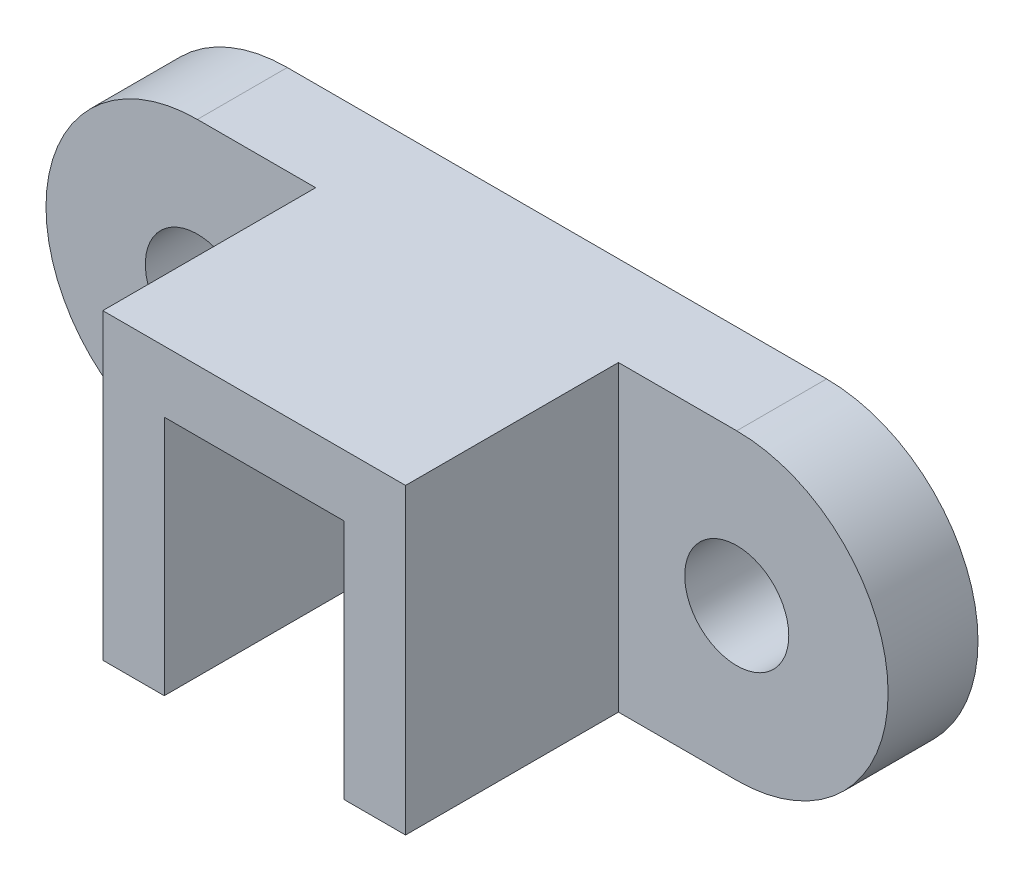
ISO-10303-21;
HEADER;
FILE_DESCRIPTION(('STEP AP214'),'2;1');
FILE_NAME('part.step','',(''),(''),'','','');
FILE_SCHEMA(('AUTOMOTIVE_DESIGN { 1 0 10303 214 1 1 1 1 }'));
ENDSEC;
DATA;
#1=APPLICATION_CONTEXT('core data for automotive mechanical design processes');
#2=APPLICATION_PROTOCOL_DEFINITION('international standard','automotive_design',2000,#1);
#3=PRODUCT_CONTEXT('',#1,'mechanical');
#4=PRODUCT('Part','Part','',(#3));
#5=PRODUCT_RELATED_PRODUCT_CATEGORY('part','',(#4));
#6=PRODUCT_DEFINITION_FORMATION('','',#4);
#7=PRODUCT_DEFINITION_CONTEXT('part definition',#1,'design');
#8=PRODUCT_DEFINITION('design','',#6,#7);
#9=PRODUCT_DEFINITION_SHAPE('','',#8);
#10=(LENGTH_UNIT() NAMED_UNIT(*) SI_UNIT(.MILLI.,.METRE.));
#11=(NAMED_UNIT(*) PLANE_ANGLE_UNIT() SI_UNIT($,.RADIAN.));
#12=(NAMED_UNIT(*) SI_UNIT($,.STERADIAN.) SOLID_ANGLE_UNIT());
#13=UNCERTAINTY_MEASURE_WITH_UNIT(LENGTH_MEASURE(1.E-05),#10,'distance_accuracy_value','');
#14=(GEOMETRIC_REPRESENTATION_CONTEXT(3) GLOBAL_UNCERTAINTY_ASSIGNED_CONTEXT((#13)) GLOBAL_UNIT_ASSIGNED_CONTEXT((#10,
#11,#12)) REPRESENTATION_CONTEXT('',''));
#15=CARTESIAN_POINT('',(0.,0.,0.));
#16=DIRECTION('',(0.,0.,1.));
#17=DIRECTION('',(1.,0.,0.));
#18=AXIS2_PLACEMENT_3D('',#15,#16,#17);
#19=CARTESIAN_POINT('',(0.,-32.,19.));
#20=DIRECTION('',(0.,1.,0.));
#21=DIRECTION('',(-1.,0.,0.));
#22=AXIS2_PLACEMENT_3D('',#19,#20,#21);
#23=PLANE('',#22);
#24=DIRECTION('',(0.,0.,1.));
#25=VECTOR('',#24,1.);
#26=CARTESIAN_POINT('',(-38.,-32.,13.));
#27=LINE('',#26,#25);
#28=CARTESIAN_POINT('',(-38.,-32.,13.));
#29=VERTEX_POINT('',#28);
#30=CARTESIAN_POINT('',(-38.,-32.,64.));
#31=VERTEX_POINT('',#30);
#32=EDGE_CURVE('E120',#29,#31,#27,.T.);
#33=ORIENTED_EDGE('',*,*,#32,.F.);
#34=DIRECTION('',(-1.,0.,0.));
#35=VECTOR('',#34,1.);
#36=CARTESIAN_POINT('',(-38.,-32.,13.));
#37=LINE('',#36,#35);
#38=CARTESIAN_POINT('',(-76.,-32.,13.));
#39=VERTEX_POINT('',#38);
#40=EDGE_CURVE('E152',#29,#39,#37,.T.);
#41=ORIENTED_EDGE('',*,*,#40,.T.);
#42=DIRECTION('',(0.,0.,1.));
#43=VECTOR('',#42,1.);
#44=CARTESIAN_POINT('',(-76.,-32.,13.));
#45=LINE('',#44,#43);
#46=CARTESIAN_POINT('',(-76.,-32.,64.));
#47=VERTEX_POINT('',#46);
#48=EDGE_CURVE('E234',#39,#47,#45,.T.);
#49=ORIENTED_EDGE('',*,*,#48,.T.);
#50=DIRECTION('',(1.,0.,0.));
#51=VECTOR('',#50,1.);
#52=CARTESIAN_POINT('',(-89.,-32.,64.));
#53=LINE('',#52,#51);
#54=CARTESIAN_POINT('',(-89.,-32.,64.));
#55=VERTEX_POINT('',#54);
#56=EDGE_CURVE('E142',#55,#47,#53,.T.);
#57=ORIENTED_EDGE('',*,*,#56,.F.);
#58=DIRECTION('',(0.,0.,-1.));
#59=VECTOR('',#58,1.);
#60=CARTESIAN_POINT('',(-89.,-32.,64.));
#61=LINE('',#60,#59);
#62=CARTESIAN_POINT('',(-89.,-32.,19.));
#63=VERTEX_POINT('',#62);
#64=EDGE_CURVE('E157',#55,#63,#61,.T.);
#65=ORIENTED_EDGE('',*,*,#64,.T.);
#66=DIRECTION('',(1.,0.,0.));
#67=VECTOR('',#66,1.);
#68=CARTESIAN_POINT('',(0.,-32.,19.));
#69=LINE('',#68,#67);
#70=CARTESIAN_POINT('',(-114.,-32.,19.));
#71=VERTEX_POINT('',#70);
#72=EDGE_CURVE('E189',#71,#63,#69,.T.);
#73=ORIENTED_EDGE('',*,*,#72,.F.);
#74=DIRECTION('',(0.,0.,-1.));
#75=VECTOR('',#74,1.);
#76=CARTESIAN_POINT('',(-114.,-32.,19.));
#77=LINE('',#76,#75);
#78=CARTESIAN_POINT('',(-114.,-32.,0.));
#79=VERTEX_POINT('',#78);
#80=EDGE_CURVE('E201',#71,#79,#77,.T.);
#81=ORIENTED_EDGE('',*,*,#80,.T.);
#82=DIRECTION('',(1.,0.,0.));
#83=VECTOR('',#82,1.);
#84=CARTESIAN_POINT('',(0.,-32.,0.));
#85=LINE('',#84,#83);
#86=CARTESIAN_POINT('',(0.,-32.,0.));
#87=VERTEX_POINT('',#86);
#88=EDGE_CURVE('E183',#79,#87,#85,.T.);
#89=ORIENTED_EDGE('',*,*,#88,.T.);
#90=DIRECTION('',(0.,0.,-1.));
#91=VECTOR('',#90,1.);
#92=CARTESIAN_POINT('',(0.,-32.,19.));
#93=LINE('',#92,#91);
#94=CARTESIAN_POINT('',(0.,-32.,19.));
#95=VERTEX_POINT('',#94);
#96=EDGE_CURVE('E191',#95,#87,#93,.T.);
#97=ORIENTED_EDGE('',*,*,#96,.F.);
#98=CARTESIAN_POINT('',(-25.,-32.,19.));
#99=VERTEX_POINT('',#98);
#100=EDGE_CURVE('E188',#99,#95,#69,.T.);
#101=ORIENTED_EDGE('',*,*,#100,.F.);
#102=DIRECTION('',(0.,0.,-1.));
#103=VECTOR('',#102,1.);
#104=CARTESIAN_POINT('',(-25.,-32.,64.));
#105=LINE('',#104,#103);
#106=CARTESIAN_POINT('',(-25.,-32.,64.));
#107=VERTEX_POINT('',#106);
#108=EDGE_CURVE('E140',#107,#99,#105,.T.);
#109=ORIENTED_EDGE('',*,*,#108,.F.);
#110=EDGE_CURVE('E134',#31,#107,#53,.T.);
#111=ORIENTED_EDGE('',*,*,#110,.F.);
#112=EDGE_LOOP('',(#33,#41,#49,#57,#65,#73,#81,#89,#97,#101,#109,#111));
#113=FACE_BOUND('',#112,.T.);
#114=ADVANCED_FACE('F37',(#113),#23,.F.);
#115=CARTESIAN_POINT('',(0.,0.,64.));
#116=DIRECTION('',(0.,0.,1.));
#117=DIRECTION('',(1.,0.,0.));
#118=AXIS2_PLACEMENT_3D('',#115,#116,#117);
#119=PLANE('',#118);
#120=DIRECTION('',(-1.,0.,0.));
#121=VECTOR('',#120,1.);
#122=CARTESIAN_POINT('',(-38.,19.,64.));
#123=LINE('',#122,#121);
#124=CARTESIAN_POINT('',(-38.,19.,64.));
#125=VERTEX_POINT('',#124);
#126=CARTESIAN_POINT('',(-76.,19.,64.));
#127=VERTEX_POINT('',#126);
#128=EDGE_CURVE('E137',#125,#127,#123,.T.);
#129=ORIENTED_EDGE('',*,*,#128,.F.);
#130=DIRECTION('',(0.,1.,0.));
#131=VECTOR('',#130,1.);
#132=CARTESIAN_POINT('',(-38.,-32.,64.));
#133=LINE('',#132,#131);
#134=EDGE_CURVE('E123',#31,#125,#133,.T.);
#135=ORIENTED_EDGE('',*,*,#134,.F.);
#136=ORIENTED_EDGE('',*,*,#110,.T.);
#137=DIRECTION('',(0.,1.,0.));
#138=VECTOR('',#137,1.);
#139=CARTESIAN_POINT('',(-25.,32.,64.));
#140=LINE('',#139,#138);
#141=CARTESIAN_POINT('',(-25.,32.,64.));
#142=VERTEX_POINT('',#141);
#143=EDGE_CURVE('E155',#107,#142,#140,.T.);
#144=ORIENTED_EDGE('',*,*,#143,.T.);
#145=DIRECTION('',(-1.,0.,0.));
#146=VECTOR('',#145,1.);
#147=CARTESIAN_POINT('',(-89.,32.,64.));
#148=LINE('',#147,#146);
#149=CARTESIAN_POINT('',(-89.,32.,64.));
#150=VERTEX_POINT('',#149);
#151=EDGE_CURVE('E146',#142,#150,#148,.T.);
#152=ORIENTED_EDGE('',*,*,#151,.T.);
#153=DIRECTION('',(0.,-1.,0.));
#154=VECTOR('',#153,1.);
#155=CARTESIAN_POINT('',(-89.,32.,64.));
#156=LINE('',#155,#154);
#157=EDGE_CURVE('E143',#150,#55,#156,.T.);
#158=ORIENTED_EDGE('',*,*,#157,.T.);
#159=ORIENTED_EDGE('',*,*,#56,.T.);
#160=DIRECTION('',(0.,1.,0.));
#161=VECTOR('',#160,1.);
#162=CARTESIAN_POINT('',(-76.,-32.,64.));
#163=LINE('',#162,#161);
#164=EDGE_CURVE('E232',#47,#127,#163,.T.);
#165=ORIENTED_EDGE('',*,*,#164,.T.);
#166=EDGE_LOOP('',(#129,#135,#136,#144,#152,#158,#159,#165));
#167=FACE_BOUND('',#166,.T.);
#168=ADVANCED_FACE('F132',(#167),#119,.T.);
#169=CARTESIAN_POINT('',(0.,0.,19.));
#170=DIRECTION('',(0.,0.,1.));
#171=DIRECTION('',(1.,0.,0.));
#172=AXIS2_PLACEMENT_3D('',#169,#170,#171);
#173=PLANE('',#172);
#174=DIRECTION('',(0.,1.,0.));
#175=VECTOR('',#174,1.);
#176=CARTESIAN_POINT('',(-25.,32.,19.));
#177=LINE('',#176,#175);
#178=CARTESIAN_POINT('',(-25.,32.,19.));
#179=VERTEX_POINT('',#178);
#180=EDGE_CURVE('E60',#99,#179,#177,.T.);
#181=ORIENTED_EDGE('',*,*,#180,.F.);
#182=ORIENTED_EDGE('',*,*,#100,.T.);
#183=CARTESIAN_POINT('',(0.,0.,19.));
#184=DIRECTION('',(0.,0.,1.));
#185=DIRECTION('',(1.,0.,0.));
#186=AXIS2_PLACEMENT_3D('',#183,#184,#185);
#187=CIRCLE('',#186,32.);
#188=CARTESIAN_POINT('',(0.,32.,19.));
#189=VERTEX_POINT('',#188);
#190=EDGE_CURVE('E179',#95,#189,#187,.T.);
#191=ORIENTED_EDGE('',*,*,#190,.T.);
#192=DIRECTION('',(-1.,0.,0.));
#193=VECTOR('',#192,1.);
#194=CARTESIAN_POINT('',(0.,32.,19.));
#195=LINE('',#194,#193);
#196=EDGE_CURVE('E184',#189,#179,#195,.T.);
#197=ORIENTED_EDGE('',*,*,#196,.T.);
#198=EDGE_LOOP('',(#181,#182,#191,#197));
#199=FACE_BOUND('',#198,.T.);
#200=CARTESIAN_POINT('',(0.,0.,19.));
#201=DIRECTION('',(0.,0.,1.));
#202=DIRECTION('',(1.,0.,0.));
#203=AXIS2_PLACEMENT_3D('',#200,#201,#202);
#204=CIRCLE('',#203,11.);
#205=CARTESIAN_POINT('',(11.,0.,19.));
#206=VERTEX_POINT('',#205);
#207=EDGE_CURVE('E167',#206,#206,#204,.T.);
#208=ORIENTED_EDGE('',*,*,#207,.F.);
#209=EDGE_LOOP('',(#208));
#210=FACE_BOUND('',#209,.T.);
#211=ADVANCED_FACE('F222',(#199,#210),#173,.T.);
#212=DIRECTION('',(0.,-1.,0.));
#213=VECTOR('',#212,1.);
#214=CARTESIAN_POINT('',(-89.,32.,19.));
#215=LINE('',#214,#213);
#216=CARTESIAN_POINT('',(-89.,32.,19.));
#217=VERTEX_POINT('',#216);
#218=EDGE_CURVE('E151',#217,#63,#215,.T.);
#219=ORIENTED_EDGE('',*,*,#218,.F.);
#220=CARTESIAN_POINT('',(-114.,32.,19.));
#221=VERTEX_POINT('',#220);
#222=EDGE_CURVE('E182',#217,#221,#195,.T.);
#223=ORIENTED_EDGE('',*,*,#222,.T.);
#224=CARTESIAN_POINT('',(-114.,0.,19.));
#225=DIRECTION('',(0.,0.,1.));
#226=DIRECTION('',(1.,0.,0.));
#227=AXIS2_PLACEMENT_3D('',#224,#225,#226);
#228=CIRCLE('',#227,32.);
#229=EDGE_CURVE('E186',#221,#71,#228,.T.);
#230=ORIENTED_EDGE('',*,*,#229,.T.);
#231=ORIENTED_EDGE('',*,*,#72,.T.);
#232=EDGE_LOOP('',(#219,#223,#230,#231));
#233=FACE_BOUND('',#232,.T.);
#234=CARTESIAN_POINT('',(-114.,0.,19.));
#235=DIRECTION('',(0.,0.,1.));
#236=DIRECTION('',(1.,0.,0.));
#237=AXIS2_PLACEMENT_3D('',#234,#235,#236);
#238=CIRCLE('',#237,11.);
#239=CARTESIAN_POINT('',(-103.,0.,19.));
#240=VERTEX_POINT('',#239);
#241=EDGE_CURVE('E173',#240,#240,#238,.T.);
#242=ORIENTED_EDGE('',*,*,#241,.F.);
#243=EDGE_LOOP('',(#242));
#244=FACE_BOUND('',#243,.T.);
#245=ADVANCED_FACE('F244',(#233,#244),#173,.T.);
#246=CARTESIAN_POINT('',(0.,0.,0.));
#247=DIRECTION('',(0.,0.,1.));
#248=DIRECTION('',(1.,0.,0.));
#249=AXIS2_PLACEMENT_3D('',#246,#247,#248);
#250=PLANE('',#249);
#251=CARTESIAN_POINT('',(0.,0.,0.));
#252=DIRECTION('',(0.,0.,1.));
#253=DIRECTION('',(1.,0.,0.));
#254=AXIS2_PLACEMENT_3D('',#251,#252,#253);
#255=CIRCLE('',#254,32.);
#256=CARTESIAN_POINT('',(0.,32.,0.));
#257=VERTEX_POINT('',#256);
#258=EDGE_CURVE('E176',#87,#257,#255,.T.);
#259=ORIENTED_EDGE('',*,*,#258,.F.);
#260=ORIENTED_EDGE('',*,*,#88,.F.);
#261=CARTESIAN_POINT('',(-114.,0.,0.));
#262=DIRECTION('',(0.,0.,1.));
#263=DIRECTION('',(1.,0.,0.));
#264=AXIS2_PLACEMENT_3D('',#261,#262,#263);
#265=CIRCLE('',#264,32.);
#266=CARTESIAN_POINT('',(-114.,32.,0.));
#267=VERTEX_POINT('',#266);
#268=EDGE_CURVE('E196',#267,#79,#265,.T.);
#269=ORIENTED_EDGE('',*,*,#268,.F.);
#270=DIRECTION('',(-1.,0.,0.));
#271=VECTOR('',#270,1.);
#272=CARTESIAN_POINT('',(0.,32.,0.));
#273=LINE('',#272,#271);
#274=EDGE_CURVE('E194',#257,#267,#273,.T.);
#275=ORIENTED_EDGE('',*,*,#274,.F.);
#276=EDGE_LOOP('',(#259,#260,#269,#275));
#277=FACE_BOUND('',#276,.T.);
#278=CARTESIAN_POINT('',(-114.,0.,0.));
#279=DIRECTION('',(0.,0.,1.));
#280=DIRECTION('',(1.,0.,0.));
#281=AXIS2_PLACEMENT_3D('',#278,#279,#280);
#282=CIRCLE('',#281,11.);
#283=CARTESIAN_POINT('',(-103.,0.,0.));
#284=VERTEX_POINT('',#283);
#285=EDGE_CURVE('E170',#284,#284,#282,.T.);
#286=ORIENTED_EDGE('',*,*,#285,.T.);
#287=EDGE_LOOP('',(#286));
#288=FACE_BOUND('',#287,.T.);
#289=CARTESIAN_POINT('',(0.,0.,0.));
#290=DIRECTION('',(0.,0.,1.));
#291=DIRECTION('',(1.,0.,0.));
#292=AXIS2_PLACEMENT_3D('',#289,#290,#291);
#293=CIRCLE('',#292,11.);
#294=CARTESIAN_POINT('',(11.,0.,0.));
#295=VERTEX_POINT('',#294);
#296=EDGE_CURVE('E166',#295,#295,#293,.T.);
#297=ORIENTED_EDGE('',*,*,#296,.T.);
#298=EDGE_LOOP('',(#297));
#299=FACE_BOUND('',#298,.T.);
#300=ADVANCED_FACE('F215',(#277,#288,#299),#250,.F.);
#301=CARTESIAN_POINT('',(0.,0.,19.));
#302=DIRECTION('',(0.,0.,-1.));
#303=DIRECTION('',(-1.,0.,0.));
#304=AXIS2_PLACEMENT_3D('',#301,#302,#303);
#305=CYLINDRICAL_SURFACE('',#304,32.);
#306=ORIENTED_EDGE('',*,*,#258,.T.);
#307=DIRECTION('',(0.,0.,-1.));
#308=VECTOR('',#307,1.);
#309=CARTESIAN_POINT('',(0.,32.,19.));
#310=LINE('',#309,#308);
#311=EDGE_CURVE('E11',#189,#257,#310,.T.);
#312=ORIENTED_EDGE('',*,*,#311,.F.);
#313=ORIENTED_EDGE('',*,*,#190,.F.);
#314=ORIENTED_EDGE('',*,*,#96,.T.);
#315=EDGE_LOOP('',(#306,#312,#313,#314));
#316=FACE_BOUND('',#315,.T.);
#317=ADVANCED_FACE('F39',(#316),#305,.T.);
#318=CARTESIAN_POINT('',(0.,32.,19.));
#319=DIRECTION('',(0.,-1.,0.));
#320=DIRECTION('',(1.,0.,0.));
#321=AXIS2_PLACEMENT_3D('',#318,#319,#320);
#322=PLANE('',#321);
#323=ORIENTED_EDGE('',*,*,#274,.T.);
#324=DIRECTION('',(0.,0.,-1.));
#325=VECTOR('',#324,1.);
#326=CARTESIAN_POINT('',(-114.,32.,19.));
#327=LINE('',#326,#325);
#328=EDGE_CURVE('E45',#221,#267,#327,.T.);
#329=ORIENTED_EDGE('',*,*,#328,.F.);
#330=ORIENTED_EDGE('',*,*,#222,.F.);
#331=DIRECTION('',(0.,0.,-1.));
#332=VECTOR('',#331,1.);
#333=CARTESIAN_POINT('',(-89.,32.,64.));
#334=LINE('',#333,#332);
#335=EDGE_CURVE('E160',#150,#217,#334,.T.);
#336=ORIENTED_EDGE('',*,*,#335,.F.);
#337=ORIENTED_EDGE('',*,*,#151,.F.);
#338=DIRECTION('',(0.,0.,-1.));
#339=VECTOR('',#338,1.);
#340=CARTESIAN_POINT('',(-25.,32.,64.));
#341=LINE('',#340,#339);
#342=EDGE_CURVE('E163',#142,#179,#341,.T.);
#343=ORIENTED_EDGE('',*,*,#342,.T.);
#344=ORIENTED_EDGE('',*,*,#196,.F.);
#345=ORIENTED_EDGE('',*,*,#311,.T.);
#346=EDGE_LOOP('',(#323,#329,#330,#336,#337,#343,#344,#345));
#347=FACE_BOUND('',#346,.T.);
#348=ADVANCED_FACE('F246',(#347),#322,.F.);
#349=CARTESIAN_POINT('',(-114.,0.,19.));
#350=DIRECTION('',(0.,0.,-1.));
#351=DIRECTION('',(-1.,0.,0.));
#352=AXIS2_PLACEMENT_3D('',#349,#350,#351);
#353=CYLINDRICAL_SURFACE('',#352,32.);
#354=ORIENTED_EDGE('',*,*,#268,.T.);
#355=ORIENTED_EDGE('',*,*,#80,.F.);
#356=ORIENTED_EDGE('',*,*,#229,.F.);
#357=ORIENTED_EDGE('',*,*,#328,.T.);
#358=EDGE_LOOP('',(#354,#355,#356,#357));
#359=FACE_BOUND('',#358,.T.);
#360=ADVANCED_FACE('F208',(#359),#353,.T.);
#361=CARTESIAN_POINT('',(-114.,0.,19.));
#362=DIRECTION('',(0.,0.,-1.));
#363=DIRECTION('',(-1.,0.,0.));
#364=AXIS2_PLACEMENT_3D('',#361,#362,#363);
#365=CYLINDRICAL_SURFACE('',#364,11.);
#366=ORIENTED_EDGE('',*,*,#241,.T.);
#367=EDGE_LOOP('',(#366));
#368=FACE_BOUND('',#367,.T.);
#369=ORIENTED_EDGE('',*,*,#285,.F.);
#370=EDGE_LOOP('',(#369));
#371=FACE_BOUND('',#370,.T.);
#372=ADVANCED_FACE('F252',(#368,#371),#365,.F.);
#373=CARTESIAN_POINT('',(0.,0.,19.));
#374=DIRECTION('',(0.,0.,-1.));
#375=DIRECTION('',(-1.,0.,0.));
#376=AXIS2_PLACEMENT_3D('',#373,#374,#375);
#377=CYLINDRICAL_SURFACE('',#376,11.);
#378=ORIENTED_EDGE('',*,*,#207,.T.);
#379=EDGE_LOOP('',(#378));
#380=FACE_BOUND('',#379,.T.);
#381=ORIENTED_EDGE('',*,*,#296,.F.);
#382=EDGE_LOOP('',(#381));
#383=FACE_BOUND('',#382,.T.);
#384=ADVANCED_FACE('F267',(#380,#383),#377,.F.);
#385=CARTESIAN_POINT('',(-25.,32.,64.));
#386=DIRECTION('',(-1.,0.,0.));
#387=DIRECTION('',(0.,-1.,0.));
#388=AXIS2_PLACEMENT_3D('',#385,#386,#387);
#389=PLANE('',#388);
#390=ORIENTED_EDGE('',*,*,#180,.T.);
#391=ORIENTED_EDGE('',*,*,#342,.F.);
#392=ORIENTED_EDGE('',*,*,#143,.F.);
#393=ORIENTED_EDGE('',*,*,#108,.T.);
#394=EDGE_LOOP('',(#390,#391,#392,#393));
#395=FACE_BOUND('',#394,.T.);
#396=ADVANCED_FACE('F225',(#395),#389,.F.);
#397=CARTESIAN_POINT('',(-89.,32.,64.));
#398=DIRECTION('',(1.,0.,0.));
#399=DIRECTION('',(0.,1.,0.));
#400=AXIS2_PLACEMENT_3D('',#397,#398,#399);
#401=PLANE('',#400);
#402=ORIENTED_EDGE('',*,*,#218,.T.);
#403=ORIENTED_EDGE('',*,*,#64,.F.);
#404=ORIENTED_EDGE('',*,*,#157,.F.);
#405=ORIENTED_EDGE('',*,*,#335,.T.);
#406=EDGE_LOOP('',(#402,#403,#404,#405));
#407=FACE_BOUND('',#406,.T.);
#408=ADVANCED_FACE('F242',(#407),#401,.F.);
#409=CARTESIAN_POINT('',(-38.,19.,64.));
#410=DIRECTION('',(0.,0.707106781186547,-0.707106781186548));
#411=DIRECTION('',(0.,0.707106781186548,0.707106781186547));
#412=AXIS2_PLACEMENT_3D('',#409,#410,#411);
#413=PLANE('',#412);
#414=DIRECTION('',(0.,-0.707106781186548,-0.707106781186547));
#415=VECTOR('',#414,1.);
#416=CARTESIAN_POINT('',(-76.,19.,64.));
#417=LINE('',#416,#415);
#418=EDGE_CURVE('E52',#127,#39,#417,.T.);
#419=ORIENTED_EDGE('',*,*,#418,.T.);
#420=ORIENTED_EDGE('',*,*,#40,.F.);
#421=DIRECTION('',(0.,-0.707106781186548,-0.707106781186547));
#422=VECTOR('',#421,1.);
#423=CARTESIAN_POINT('',(-38.,19.,64.));
#424=LINE('',#423,#422);
#425=EDGE_CURVE('E125',#125,#29,#424,.T.);
#426=ORIENTED_EDGE('',*,*,#425,.F.);
#427=ORIENTED_EDGE('',*,*,#128,.T.);
#428=EDGE_LOOP('',(#419,#420,#426,#427));
#429=FACE_BOUND('',#428,.T.);
#430=ADVANCED_FACE('F275',(#429),#413,.F.);
#431=CARTESIAN_POINT('',(-38.,0.,0.));
#432=DIRECTION('',(-1.,0.,0.));
#433=DIRECTION('',(0.,-1.,0.));
#434=AXIS2_PLACEMENT_3D('',#431,#432,#433);
#435=PLANE('',#434);
#436=ORIENTED_EDGE('',*,*,#32,.T.);
#437=ORIENTED_EDGE('',*,*,#134,.T.);
#438=ORIENTED_EDGE('',*,*,#425,.T.);
#439=EDGE_LOOP('',(#436,#437,#438));
#440=FACE_BOUND('',#439,.T.);
#441=ADVANCED_FACE('F122',(#440),#435,.T.);
#442=CARTESIAN_POINT('',(-76.,0.,0.));
#443=DIRECTION('',(-1.,0.,0.));
#444=DIRECTION('',(0.,-1.,0.));
#445=AXIS2_PLACEMENT_3D('',#442,#443,#444);
#446=PLANE('',#445);
#447=ORIENTED_EDGE('',*,*,#48,.F.);
#448=ORIENTED_EDGE('',*,*,#418,.F.);
#449=ORIENTED_EDGE('',*,*,#164,.F.);
#450=EDGE_LOOP('',(#447,#448,#449));
#451=FACE_BOUND('',#450,.T.);
#452=ADVANCED_FACE('F280',(#451),#446,.F.);
#453=CLOSED_SHELL('',(#114,#168,#211,#245,#300,#317,#348,#360,#372,#384,#396,#408,#430,#441,#452));
#454=MANIFOLD_SOLID_BREP('B2',#453);
#455=ADVANCED_BREP_SHAPE_REPRESENTATION('',(#18,#454),#14);
#456=SHAPE_DEFINITION_REPRESENTATION(#9,#455);
ENDSEC;
END-ISO-10303-21;
